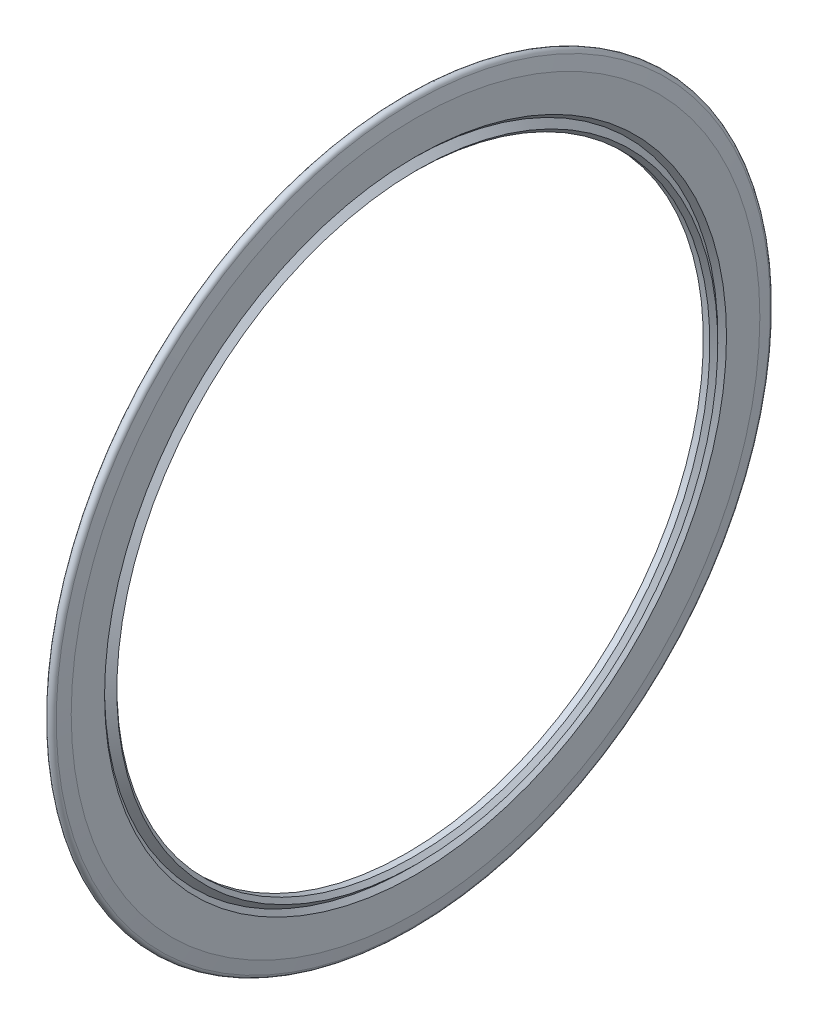
ISO-10303-21;
HEADER;
FILE_DESCRIPTION(('STEP AP214'),'2;1');
FILE_NAME('part.step','',(''),(''),'','','');
FILE_SCHEMA(('AUTOMOTIVE_DESIGN { 1 0 10303 214 1 1 1 1 }'));
ENDSEC;
DATA;
#1=APPLICATION_CONTEXT('core data for automotive mechanical design processes');
#2=APPLICATION_PROTOCOL_DEFINITION('international standard','automotive_design',2000,#1);
#3=PRODUCT_CONTEXT('',#1,'mechanical');
#4=PRODUCT('Part','Part','',(#3));
#5=PRODUCT_RELATED_PRODUCT_CATEGORY('part','',(#4));
#6=PRODUCT_DEFINITION_FORMATION('','',#4);
#7=PRODUCT_DEFINITION_CONTEXT('part definition',#1,'design');
#8=PRODUCT_DEFINITION('design','',#6,#7);
#9=PRODUCT_DEFINITION_SHAPE('','',#8);
#10=(LENGTH_UNIT() NAMED_UNIT(*) SI_UNIT(.MILLI.,.METRE.));
#11=(NAMED_UNIT(*) PLANE_ANGLE_UNIT() SI_UNIT($,.RADIAN.));
#12=(NAMED_UNIT(*) SI_UNIT($,.STERADIAN.) SOLID_ANGLE_UNIT());
#13=UNCERTAINTY_MEASURE_WITH_UNIT(LENGTH_MEASURE(1.E-05),#10,'distance_accuracy_value','');
#14=(GEOMETRIC_REPRESENTATION_CONTEXT(3) GLOBAL_UNCERTAINTY_ASSIGNED_CONTEXT((#13)) GLOBAL_UNIT_ASSIGNED_CONTEXT((#10,
#11,#12)) REPRESENTATION_CONTEXT('',''));
#15=CARTESIAN_POINT('',(0.,0.,0.));
#16=DIRECTION('',(0.,0.,1.));
#17=DIRECTION('',(1.,0.,0.));
#18=AXIS2_PLACEMENT_3D('',#15,#16,#17);
#19=CARTESIAN_POINT('',(0.28,45.18775,0.));
#20=DIRECTION('',(-1.,0.,0.));
#21=DIRECTION('',(0.,-1.,0.));
#22=AXIS2_PLACEMENT_3D('',#19,#20,#21);
#23=PLANE('',#22);
#24=CARTESIAN_POINT('',(0.28,0.,0.));
#25=DIRECTION('',(1.,0.,0.));
#26=DIRECTION('',(0.,1.,0.));
#27=AXIS2_PLACEMENT_3D('',#24,#25,#26);
#28=CIRCLE('',#27,44.57975);
#29=CARTESIAN_POINT('',(0.28,44.57975,0.));
#30=VERTEX_POINT('',#29);
#31=EDGE_CURVE('E11',#30,#30,#28,.T.);
#32=ORIENTED_EDGE('',*,*,#31,.T.);
#33=EDGE_LOOP('',(#32));
#34=FACE_BOUND('',#33,.T.);
#35=CARTESIAN_POINT('',(0.28,0.,0.));
#36=DIRECTION('',(1.,0.,0.));
#37=DIRECTION('',(0.,1.,0.));
#38=AXIS2_PLACEMENT_3D('',#35,#36,#37);
#39=CIRCLE('',#38,45.79575);
#40=CARTESIAN_POINT('',(0.28,45.79575,0.));
#41=VERTEX_POINT('',#40);
#42=EDGE_CURVE('E51',#41,#41,#39,.T.);
#43=ORIENTED_EDGE('',*,*,#42,.F.);
#44=EDGE_LOOP('',(#43));
#45=FACE_BOUND('',#44,.T.);
#46=ADVANCED_FACE('F17',(#34,#45),#23,.T.);
#47=CARTESIAN_POINT('',(0.42,0.,0.));
#48=DIRECTION('',(-1.,0.,0.));
#49=DIRECTION('',(0.,1.,0.));
#50=AXIS2_PLACEMENT_3D('',#47,#48,#49);
#51=CONICAL_SURFACE('',#50,44.43975,0.78539816339745);
#52=CARTESIAN_POINT('',(0.56,0.,0.));
#53=DIRECTION('',(1.,0.,0.));
#54=DIRECTION('',(0.,1.,0.));
#55=AXIS2_PLACEMENT_3D('',#52,#53,#54);
#56=CIRCLE('',#55,44.29975);
#57=CARTESIAN_POINT('',(0.56,44.29975,0.));
#58=VERTEX_POINT('',#57);
#59=EDGE_CURVE('E27',#58,#58,#56,.T.);
#60=ORIENTED_EDGE('',*,*,#59,.T.);
#61=EDGE_LOOP('',(#60));
#62=FACE_BOUND('',#61,.T.);
#63=ORIENTED_EDGE('',*,*,#31,.F.);
#64=EDGE_LOOP('',(#63));
#65=FACE_BOUND('',#64,.T.);
#66=ADVANCED_FACE('F127',(#62,#65),#51,.F.);
#67=CARTESIAN_POINT('',(0.56,42.29975,0.));
#68=DIRECTION('',(-1.,0.,0.));
#69=DIRECTION('',(0.,-1.,0.));
#70=AXIS2_PLACEMENT_3D('',#67,#68,#69);
#71=PLANE('',#70);
#72=CARTESIAN_POINT('',(0.56,0.,0.));
#73=DIRECTION('',(1.,0.,0.));
#74=DIRECTION('',(0.,1.,0.));
#75=AXIS2_PLACEMENT_3D('',#72,#73,#74);
#76=CIRCLE('',#75,40.29975);
#77=CARTESIAN_POINT('',(0.56,40.29975,0.));
#78=VERTEX_POINT('',#77);
#79=EDGE_CURVE('E95',#78,#78,#76,.T.);
#80=ORIENTED_EDGE('',*,*,#79,.T.);
#81=EDGE_LOOP('',(#80));
#82=FACE_BOUND('',#81,.T.);
#83=ORIENTED_EDGE('',*,*,#59,.F.);
#84=EDGE_LOOP('',(#83));
#85=FACE_BOUND('',#84,.T.);
#86=ADVANCED_FACE('F132',(#82,#85),#71,.T.);
#87=CARTESIAN_POINT('',(0.42,0.,0.));
#88=DIRECTION('',(1.,0.,0.));
#89=DIRECTION('',(0.,1.,0.));
#90=AXIS2_PLACEMENT_3D('',#87,#88,#89);
#91=CONICAL_SURFACE('',#90,40.15975,0.785398163397438);
#92=CARTESIAN_POINT('',(0.28,0.,0.));
#93=DIRECTION('',(1.,0.,0.));
#94=DIRECTION('',(0.,1.,0.));
#95=AXIS2_PLACEMENT_3D('',#92,#93,#94);
#96=CIRCLE('',#95,40.01975);
#97=CARTESIAN_POINT('',(0.28,40.01975,0.));
#98=VERTEX_POINT('',#97);
#99=EDGE_CURVE('E72',#98,#98,#96,.T.);
#100=ORIENTED_EDGE('',*,*,#99,.T.);
#101=EDGE_LOOP('',(#100));
#102=FACE_BOUND('',#101,.T.);
#103=ORIENTED_EDGE('',*,*,#79,.F.);
#104=EDGE_LOOP('',(#103));
#105=FACE_BOUND('',#104,.T.);
#106=ADVANCED_FACE('F140',(#102,#105),#91,.T.);
#107=CARTESIAN_POINT('',(0.28,39.71575,0.));
#108=DIRECTION('',(-1.,0.,0.));
#109=DIRECTION('',(0.,-1.,0.));
#110=AXIS2_PLACEMENT_3D('',#107,#108,#109);
#111=PLANE('',#110);
#112=CARTESIAN_POINT('',(0.28,0.,0.));
#113=DIRECTION('',(1.,0.,0.));
#114=DIRECTION('',(0.,1.,0.));
#115=AXIS2_PLACEMENT_3D('',#112,#113,#114);
#116=CIRCLE('',#115,39.41175);
#117=CARTESIAN_POINT('',(0.28,39.41175,0.));
#118=VERTEX_POINT('',#117);
#119=EDGE_CURVE('E76',#118,#118,#116,.T.);
#120=ORIENTED_EDGE('',*,*,#119,.T.);
#121=EDGE_LOOP('',(#120));
#122=FACE_BOUND('',#121,.T.);
#123=ORIENTED_EDGE('',*,*,#99,.F.);
#124=EDGE_LOOP('',(#123));
#125=FACE_BOUND('',#124,.T.);
#126=ADVANCED_FACE('F138',(#122,#125),#111,.T.);
#127=CARTESIAN_POINT('',(0.674975,0.,0.));
#128=DIRECTION('',(-1.,0.,0.));
#129=DIRECTION('',(0.,1.,0.));
#130=AXIS2_PLACEMENT_3D('',#127,#128,#129);
#131=CONICAL_SURFACE('',#130,39.016775,0.785398163397448);
#132=CARTESIAN_POINT('',(1.06995,0.,0.));
#133=DIRECTION('',(1.,0.,0.));
#134=DIRECTION('',(0.,1.,0.));
#135=AXIS2_PLACEMENT_3D('',#132,#133,#134);
#136=CIRCLE('',#135,38.6218);
#137=CARTESIAN_POINT('',(1.06995,38.6218,0.));
#138=VERTEX_POINT('',#137);
#139=EDGE_CURVE('E80',#138,#138,#136,.T.);
#140=ORIENTED_EDGE('',*,*,#139,.T.);
#141=EDGE_LOOP('',(#140));
#142=FACE_BOUND('',#141,.T.);
#143=ORIENTED_EDGE('',*,*,#119,.F.);
#144=EDGE_LOOP('',(#143));
#145=FACE_BOUND('',#144,.T.);
#146=ADVANCED_FACE('F19',(#142,#145),#131,.F.);
#147=CARTESIAN_POINT('',(0.814975,0.,0.));
#148=DIRECTION('',(1.,0.,0.));
#149=DIRECTION('',(0.,1.,0.));
#150=AXIS2_PLACEMENT_3D('',#147,#148,#149);
#151=CONICAL_SURFACE('',#150,38.366825,0.785398163397453);
#152=CARTESIAN_POINT('',(0.56,0.,0.));
#153=DIRECTION('',(1.,0.,0.));
#154=DIRECTION('',(0.,1.,0.));
#155=AXIS2_PLACEMENT_3D('',#152,#153,#154);
#156=CIRCLE('',#155,38.11185);
#157=CARTESIAN_POINT('',(0.56,38.11185,0.));
#158=VERTEX_POINT('',#157);
#159=EDGE_CURVE('E84',#158,#158,#156,.T.);
#160=ORIENTED_EDGE('',*,*,#159,.T.);
#161=EDGE_LOOP('',(#160));
#162=FACE_BOUND('',#161,.T.);
#163=ORIENTED_EDGE('',*,*,#139,.F.);
#164=EDGE_LOOP('',(#163));
#165=FACE_BOUND('',#164,.T.);
#166=ADVANCED_FACE('F85',(#162,#165),#151,.T.);
#167=CARTESIAN_POINT('',(0.98,0.,0.));
#168=DIRECTION('',(-1.,0.,0.));
#169=DIRECTION('',(0.,1.,0.));
#170=AXIS2_PLACEMENT_3D('',#167,#168,#169);
#171=CYLINDRICAL_SURFACE('',#170,38.11185);
#172=CARTESIAN_POINT('',(1.4,0.,0.));
#173=DIRECTION('',(1.,0.,0.));
#174=DIRECTION('',(0.,1.,0.));
#175=AXIS2_PLACEMENT_3D('',#172,#173,#174);
#176=CIRCLE('',#175,38.11185);
#177=CARTESIAN_POINT('',(1.4,38.11185,0.));
#178=VERTEX_POINT('',#177);
#179=EDGE_CURVE('E88',#178,#178,#176,.T.);
#180=ORIENTED_EDGE('',*,*,#179,.T.);
#181=EDGE_LOOP('',(#180));
#182=FACE_BOUND('',#181,.T.);
#183=ORIENTED_EDGE('',*,*,#159,.F.);
#184=EDGE_LOOP('',(#183));
#185=FACE_BOUND('',#184,.T.);
#186=ADVANCED_FACE('F142',(#182,#185),#171,.F.);
#187=CARTESIAN_POINT('',(1.654975,0.,0.));
#188=DIRECTION('',(1.,0.,0.));
#189=DIRECTION('',(0.,1.,0.));
#190=AXIS2_PLACEMENT_3D('',#187,#188,#189);
#191=CONICAL_SURFACE('',#190,38.366825,0.785398163397449);
#192=CARTESIAN_POINT('',(1.90995,0.,0.));
#193=DIRECTION('',(1.,0.,0.));
#194=DIRECTION('',(0.,1.,0.));
#195=AXIS2_PLACEMENT_3D('',#192,#193,#194);
#196=CIRCLE('',#195,38.6218);
#197=CARTESIAN_POINT('',(1.90995,38.6218,0.));
#198=VERTEX_POINT('',#197);
#199=EDGE_CURVE('E91',#198,#198,#196,.T.);
#200=ORIENTED_EDGE('',*,*,#199,.T.);
#201=EDGE_LOOP('',(#200));
#202=FACE_BOUND('',#201,.T.);
#203=ORIENTED_EDGE('',*,*,#179,.F.);
#204=EDGE_LOOP('',(#203));
#205=FACE_BOUND('',#204,.T.);
#206=ADVANCED_FACE('F123',(#202,#205),#191,.F.);
#207=CARTESIAN_POINT('',(1.514975,0.,0.));
#208=DIRECTION('',(-1.,0.,0.));
#209=DIRECTION('',(0.,1.,0.));
#210=AXIS2_PLACEMENT_3D('',#207,#208,#209);
#211=CONICAL_SURFACE('',#210,39.016775,0.785398163397455);
#212=CARTESIAN_POINT('',(1.12,0.,0.));
#213=DIRECTION('',(1.,0.,0.));
#214=DIRECTION('',(0.,1.,0.));
#215=AXIS2_PLACEMENT_3D('',#212,#213,#214);
#216=CIRCLE('',#215,39.41175);
#217=CARTESIAN_POINT('',(1.12,39.41175,0.));
#218=VERTEX_POINT('',#217);
#219=EDGE_CURVE('E96',#218,#218,#216,.T.);
#220=ORIENTED_EDGE('',*,*,#219,.T.);
#221=EDGE_LOOP('',(#220));
#222=FACE_BOUND('',#221,.T.);
#223=ORIENTED_EDGE('',*,*,#199,.F.);
#224=EDGE_LOOP('',(#223));
#225=FACE_BOUND('',#224,.T.);
#226=ADVANCED_FACE('F107',(#222,#225),#211,.T.);
#227=CARTESIAN_POINT('',(1.4,0.,0.));
#228=DIRECTION('',(1.,0.,0.));
#229=DIRECTION('',(0.,1.,0.));
#230=AXIS2_PLACEMENT_3D('',#227,#228,#229);
#231=CONICAL_SURFACE('',#230,39.69175,0.785398163397444);
#232=CARTESIAN_POINT('',(1.68,0.,0.));
#233=DIRECTION('',(1.,0.,0.));
#234=DIRECTION('',(0.,1.,0.));
#235=AXIS2_PLACEMENT_3D('',#232,#233,#234);
#236=CIRCLE('',#235,39.97175);
#237=CARTESIAN_POINT('',(1.68,39.97175,0.));
#238=VERTEX_POINT('',#237);
#239=EDGE_CURVE('E101',#238,#238,#236,.T.);
#240=ORIENTED_EDGE('',*,*,#239,.T.);
#241=EDGE_LOOP('',(#240));
#242=FACE_BOUND('',#241,.T.);
#243=ORIENTED_EDGE('',*,*,#219,.F.);
#244=EDGE_LOOP('',(#243));
#245=FACE_BOUND('',#244,.T.);
#246=ADVANCED_FACE('F110',(#242,#245),#231,.F.);
#247=CARTESIAN_POINT('',(1.68,42.1142673710408,0.));
#248=DIRECTION('',(1.,0.,0.));
#249=DIRECTION('',(0.,1.,0.));
#250=AXIS2_PLACEMENT_3D('',#247,#248,#249);
#251=PLANE('',#250);
#252=CARTESIAN_POINT('',(1.68,0.,0.));
#253=DIRECTION('',(1.,0.,0.));
#254=DIRECTION('',(0.,1.,0.));
#255=AXIS2_PLACEMENT_3D('',#252,#253,#254);
#256=CIRCLE('',#255,44.2567847420815);
#257=CARTESIAN_POINT('',(1.68,44.2567847420815,0.));
#258=VERTEX_POINT('',#257);
#259=EDGE_CURVE('E21',#258,#258,#256,.T.);
#260=ORIENTED_EDGE('',*,*,#259,.T.);
#261=EDGE_LOOP('',(#260));
#262=FACE_BOUND('',#261,.T.);
#263=ORIENTED_EDGE('',*,*,#239,.F.);
#264=EDGE_LOOP('',(#263));
#265=FACE_BOUND('',#264,.T.);
#266=ADVANCED_FACE('F112',(#262,#265),#251,.T.);
#267=CARTESIAN_POINT('',(1.53574617084341,0.,0.));
#268=DIRECTION('',(-1.,0.,0.));
#269=DIRECTION('',(0.,1.,0.));
#270=AXIS2_PLACEMENT_3D('',#267,#268,#269);
#271=CONICAL_SURFACE('',#270,45.0748888607875,1.39626340159546);
#272=CARTESIAN_POINT('',(1.39149234168683,0.,0.));
#273=DIRECTION('',(1.,0.,0.));
#274=DIRECTION('',(0.,1.,0.));
#275=AXIS2_PLACEMENT_3D('',#272,#273,#274);
#276=CIRCLE('',#275,45.8929929794935);
#277=CARTESIAN_POINT('',(1.39149234168683,45.8929929794935,0.));
#278=VERTEX_POINT('',#277);
#279=EDGE_CURVE('E56',#278,#278,#276,.T.);
#280=ORIENTED_EDGE('',*,*,#279,.T.);
#281=EDGE_LOOP('',(#280));
#282=FACE_BOUND('',#281,.T.);
#283=ORIENTED_EDGE('',*,*,#259,.F.);
#284=EDGE_LOOP('',(#283));
#285=FACE_BOUND('',#284,.T.);
#286=ADVANCED_FACE('F120',(#282,#285),#271,.T.);
#287=CARTESIAN_POINT('',(0.84,0.,0.));
#288=DIRECTION('',(1.,0.,0.));
#289=DIRECTION('',(0.,0.,-1.));
#290=AXIS2_PLACEMENT_3D('',#287,#288,#289);
#291=TOROIDAL_SURFACE('',#290,45.79575,0.56);
#292=ORIENTED_EDGE('',*,*,#42,.T.);
#293=EDGE_LOOP('',(#292));
#294=FACE_BOUND('',#293,.T.);
#295=ORIENTED_EDGE('',*,*,#279,.F.);
#296=EDGE_LOOP('',(#295));
#297=FACE_BOUND('',#296,.T.);
#298=ADVANCED_FACE('F220',(#294,#297),#291,.T.);
#299=CLOSED_SHELL('',(#46,#66,#86,#106,#126,#146,#166,#186,#206,#226,#246,#266,#286,#298));
#300=MANIFOLD_SOLID_BREP('B1',#299);
#301=ADVANCED_BREP_SHAPE_REPRESENTATION('',(#18,#300),#14);
#302=SHAPE_DEFINITION_REPRESENTATION(#9,#301);
ENDSEC;
END-ISO-10303-21;
